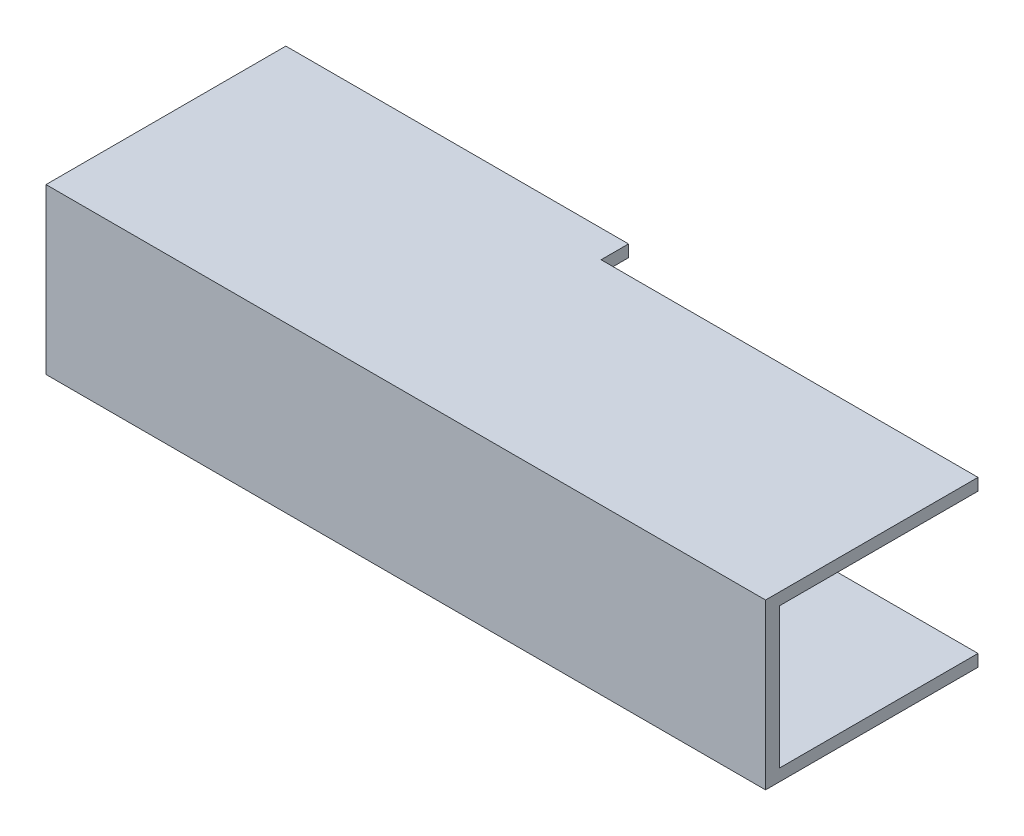
ISO-10303-21;
HEADER;
FILE_DESCRIPTION(('STEP AP214'),'2;1');
FILE_NAME('part.step','',(''),(''),'','','');
FILE_SCHEMA(('AUTOMOTIVE_DESIGN { 1 0 10303 214 1 1 1 1 }'));
ENDSEC;
DATA;
#1=APPLICATION_CONTEXT('core data for automotive mechanical design processes');
#2=APPLICATION_PROTOCOL_DEFINITION('international standard','automotive_design',2000,#1);
#3=PRODUCT_CONTEXT('',#1,'mechanical');
#4=PRODUCT('Part','Part','',(#3));
#5=PRODUCT_RELATED_PRODUCT_CATEGORY('part','',(#4));
#6=PRODUCT_DEFINITION_FORMATION('','',#4);
#7=PRODUCT_DEFINITION_CONTEXT('part definition',#1,'design');
#8=PRODUCT_DEFINITION('design','',#6,#7);
#9=PRODUCT_DEFINITION_SHAPE('','',#8);
#10=(LENGTH_UNIT() NAMED_UNIT(*) SI_UNIT(.MILLI.,.METRE.));
#11=(NAMED_UNIT(*) PLANE_ANGLE_UNIT() SI_UNIT($,.RADIAN.));
#12=(NAMED_UNIT(*) SI_UNIT($,.STERADIAN.) SOLID_ANGLE_UNIT());
#13=UNCERTAINTY_MEASURE_WITH_UNIT(LENGTH_MEASURE(1.E-05),#10,'distance_accuracy_value','');
#14=(GEOMETRIC_REPRESENTATION_CONTEXT(3) GLOBAL_UNCERTAINTY_ASSIGNED_CONTEXT((#13)) GLOBAL_UNIT_ASSIGNED_CONTEXT((#10,
#11,#12)) REPRESENTATION_CONTEXT('',''));
#15=CARTESIAN_POINT('',(0.,0.,0.));
#16=DIRECTION('',(0.,0.,1.));
#17=DIRECTION('',(1.,0.,0.));
#18=AXIS2_PLACEMENT_3D('',#15,#16,#17);
#19=CARTESIAN_POINT('',(0.,0.,0.));
#20=DIRECTION('',(0.,0.,1.));
#21=DIRECTION('',(1.,0.,0.));
#22=AXIS2_PLACEMENT_3D('',#19,#20,#21);
#23=PLANE('',#22);
#24=DIRECTION('',(0.,-1.,0.));
#25=VECTOR('',#24,1.);
#26=CARTESIAN_POINT('',(-18.5416666666666,18.0340909090909,0.));
#27=LINE('',#26,#25);
#28=CARTESIAN_POINT('',(-18.5416666666667,-4.21590909090913,0.));
#29=VERTEX_POINT('',#28);
#30=CARTESIAN_POINT('',(-18.5416666666667,-5.96590909090908,0.));
#31=VERTEX_POINT('',#30);
#32=EDGE_CURVE('E254',#29,#31,#27,.T.);
#33=ORIENTED_EDGE('',*,*,#32,.T.);
#34=DIRECTION('',(1.,0.,0.));
#35=VECTOR('',#34,1.);
#36=CARTESIAN_POINT('',(-68.5416666666667,-5.9659090909091,0.));
#37=LINE('',#36,#35);
#38=CARTESIAN_POINT('',(-68.5416666666667,-5.9659090909091,0.));
#39=VERTEX_POINT('',#38);
#40=EDGE_CURVE('E229',#39,#31,#37,.T.);
#41=ORIENTED_EDGE('',*,*,#40,.F.);
#42=DIRECTION('',(0.,-1.,0.));
#43=VECTOR('',#42,1.);
#44=CARTESIAN_POINT('',(-68.5416666666666,18.0340909090909,0.));
#45=LINE('',#44,#43);
#46=CARTESIAN_POINT('',(-68.5416666666667,-4.2159090909091,0.));
#47=VERTEX_POINT('',#46);
#48=EDGE_CURVE('E209',#47,#39,#45,.T.);
#49=ORIENTED_EDGE('',*,*,#48,.F.);
#50=DIRECTION('',(-1.,0.,0.));
#51=VECTOR('',#50,1.);
#52=CARTESIAN_POINT('',(-18.5416666666667,-4.21590909090913,0.));
#53=LINE('',#52,#51);
#54=EDGE_CURVE('E150',#29,#47,#53,.T.);
#55=ORIENTED_EDGE('',*,*,#54,.F.);
#56=EDGE_LOOP('',(#33,#41,#49,#55));
#57=FACE_BOUND('',#56,.T.);
#58=ADVANCED_FACE('F39',(#57),#23,.F.);
#59=CARTESIAN_POINT('',(-18.5416666666666,18.0340909090909,0.));
#60=VERTEX_POINT('',#59);
#61=CARTESIAN_POINT('',(-18.5416666666666,16.2840909090909,0.));
#62=VERTEX_POINT('',#61);
#63=EDGE_CURVE('E266',#60,#62,#27,.T.);
#64=ORIENTED_EDGE('',*,*,#63,.T.);
#65=DIRECTION('',(-1.,0.,0.));
#66=VECTOR('',#65,1.);
#67=CARTESIAN_POINT('',(-18.5416666666666,16.2840909090909,0.));
#68=LINE('',#67,#66);
#69=CARTESIAN_POINT('',(-68.5416666666666,16.2840909090909,0.));
#70=VERTEX_POINT('',#69);
#71=EDGE_CURVE('E205',#62,#70,#68,.T.);
#72=ORIENTED_EDGE('',*,*,#71,.T.);
#73=CARTESIAN_POINT('',(-68.5416666666666,18.0340909090909,0.));
#74=VERTEX_POINT('',#73);
#75=EDGE_CURVE('E225',#74,#70,#45,.T.);
#76=ORIENTED_EDGE('',*,*,#75,.F.);
#77=DIRECTION('',(-1.,0.,0.));
#78=VECTOR('',#77,1.);
#79=CARTESIAN_POINT('',(-68.5416666666666,18.0340909090909,0.));
#80=LINE('',#79,#78);
#81=EDGE_CURVE('E79',#60,#74,#80,.T.);
#82=ORIENTED_EDGE('',*,*,#81,.F.);
#83=EDGE_LOOP('',(#64,#72,#76,#82));
#84=FACE_BOUND('',#83,.T.);
#85=ADVANCED_FACE('F275',(#84),#23,.F.);
#86=CARTESIAN_POINT('',(-68.5416666666666,18.0340909090909,35.));
#87=DIRECTION('',(1.,0.,0.));
#88=DIRECTION('',(0.,1.,0.));
#89=AXIS2_PLACEMENT_3D('',#86,#87,#88);
#90=PLANE('',#89);
#91=ORIENTED_EDGE('',*,*,#75,.T.);
#92=DIRECTION('',(0.,0.,-1.));
#93=VECTOR('',#92,1.);
#94=CARTESIAN_POINT('',(-68.5416666666666,16.2840909090909,0.));
#95=LINE('',#94,#93);
#96=CARTESIAN_POINT('',(-68.5416666666666,16.2840909090909,33.));
#97=VERTEX_POINT('',#96);
#98=EDGE_CURVE('E194',#97,#70,#95,.T.);
#99=ORIENTED_EDGE('',*,*,#98,.F.);
#100=DIRECTION('',(0.,1.,0.));
#101=VECTOR('',#100,1.);
#102=CARTESIAN_POINT('',(-68.5416666666666,16.2840909090909,33.));
#103=LINE('',#102,#101);
#104=CARTESIAN_POINT('',(-68.5416666666667,-4.2159090909091,33.));
#105=VERTEX_POINT('',#104);
#106=EDGE_CURVE('E199',#105,#97,#103,.T.);
#107=ORIENTED_EDGE('',*,*,#106,.F.);
#108=DIRECTION('',(0.,0.,1.));
#109=VECTOR('',#108,1.);
#110=CARTESIAN_POINT('',(-68.5416666666667,-4.2159090909091,33.));
#111=LINE('',#110,#109);
#112=EDGE_CURVE('E144',#47,#105,#111,.T.);
#113=ORIENTED_EDGE('',*,*,#112,.F.);
#114=ORIENTED_EDGE('',*,*,#48,.T.);
#115=DIRECTION('',(0.,0.,-1.));
#116=VECTOR('',#115,1.);
#117=CARTESIAN_POINT('',(-68.5416666666667,-5.9659090909091,35.));
#118=LINE('',#117,#116);
#119=CARTESIAN_POINT('',(-68.5416666666667,-5.9659090909091,35.));
#120=VERTEX_POINT('',#119);
#121=EDGE_CURVE('E11',#120,#39,#118,.T.);
#122=ORIENTED_EDGE('',*,*,#121,.F.);
#123=DIRECTION('',(0.,-1.,0.));
#124=VECTOR('',#123,1.);
#125=CARTESIAN_POINT('',(-68.5416666666666,18.0340909090909,35.));
#126=LINE('',#125,#124);
#127=CARTESIAN_POINT('',(-68.5416666666666,18.0340909090909,35.));
#128=VERTEX_POINT('',#127);
#129=EDGE_CURVE('E214',#128,#120,#126,.T.);
#130=ORIENTED_EDGE('',*,*,#129,.F.);
#131=DIRECTION('',(0.,0.,-1.));
#132=VECTOR('',#131,1.);
#133=CARTESIAN_POINT('',(-68.5416666666666,18.0340909090909,35.));
#134=LINE('',#133,#132);
#135=EDGE_CURVE('E224',#128,#74,#134,.T.);
#136=ORIENTED_EDGE('',*,*,#135,.T.);
#137=EDGE_LOOP('',(#91,#99,#107,#113,#114,#122,#130,#136));
#138=FACE_BOUND('',#137,.T.);
#139=ADVANCED_FACE('F41',(#138),#90,.F.);
#140=CARTESIAN_POINT('',(-68.5416666666667,-5.9659090909091,35.));
#141=DIRECTION('',(0.,1.,0.));
#142=DIRECTION('',(0.,0.,1.));
#143=AXIS2_PLACEMENT_3D('',#140,#141,#142);
#144=PLANE('',#143);
#145=DIRECTION('',(0.,0.,1.));
#146=VECTOR('',#145,1.);
#147=CARTESIAN_POINT('',(-18.5416666666667,-5.96590909090908,0.));
#148=LINE('',#147,#146);
#149=CARTESIAN_POINT('',(-18.5416666666667,-5.9659090909091,4.));
#150=VERTEX_POINT('',#149);
#151=EDGE_CURVE('E246',#31,#150,#148,.T.);
#152=ORIENTED_EDGE('',*,*,#151,.T.);
#153=DIRECTION('',(1.,0.,0.));
#154=VECTOR('',#153,1.);
#155=CARTESIAN_POINT('',(-59.346078192873,-5.96590909090907,4.));
#156=LINE('',#155,#154);
#157=CARTESIAN_POINT('',(36.4583333333333,-5.9659090909091,4.));
#158=VERTEX_POINT('',#157);
#159=EDGE_CURVE('E183',#150,#158,#156,.T.);
#160=ORIENTED_EDGE('',*,*,#159,.T.);
#161=DIRECTION('',(0.,0.,-1.));
#162=VECTOR('',#161,1.);
#163=CARTESIAN_POINT('',(36.4583333333333,-5.9659090909091,35.));
#164=LINE('',#163,#162);
#165=CARTESIAN_POINT('',(36.4583333333333,-5.9659090909091,35.));
#166=VERTEX_POINT('',#165);
#167=EDGE_CURVE('E48',#166,#158,#164,.T.);
#168=ORIENTED_EDGE('',*,*,#167,.F.);
#169=DIRECTION('',(1.,0.,0.));
#170=VECTOR('',#169,1.);
#171=CARTESIAN_POINT('',(-68.5416666666667,-5.9659090909091,35.));
#172=LINE('',#171,#170);
#173=EDGE_CURVE('E86',#120,#166,#172,.T.);
#174=ORIENTED_EDGE('',*,*,#173,.F.);
#175=ORIENTED_EDGE('',*,*,#121,.T.);
#176=ORIENTED_EDGE('',*,*,#40,.T.);
#177=EDGE_LOOP('',(#152,#160,#168,#174,#175,#176));
#178=FACE_BOUND('',#177,.T.);
#179=ADVANCED_FACE('F244',(#178),#144,.F.);
#180=CARTESIAN_POINT('',(36.4583333333334,18.0340909090909,35.));
#181=DIRECTION('',(-1.,0.,0.));
#182=DIRECTION('',(0.,-1.,0.));
#183=AXIS2_PLACEMENT_3D('',#180,#181,#182);
#184=PLANE('',#183);
#185=DIRECTION('',(0.,0.,1.));
#186=VECTOR('',#185,1.);
#187=CARTESIAN_POINT('',(36.4583333333334,16.2840909090909,33.));
#188=LINE('',#187,#186);
#189=CARTESIAN_POINT('',(36.4583333333334,16.2840909090909,4.));
#190=VERTEX_POINT('',#189);
#191=CARTESIAN_POINT('',(36.4583333333334,16.2840909090909,33.));
#192=VERTEX_POINT('',#191);
#193=EDGE_CURVE('E173',#190,#192,#188,.T.);
#194=ORIENTED_EDGE('',*,*,#193,.F.);
#195=DIRECTION('',(0.,-1.,0.));
#196=VECTOR('',#195,1.);
#197=CARTESIAN_POINT('',(36.4583333333334,16.2840909090909,4.));
#198=LINE('',#197,#196);
#199=CARTESIAN_POINT('',(36.4583333333334,18.0340909090909,4.));
#200=VERTEX_POINT('',#199);
#201=EDGE_CURVE('E166',#200,#190,#198,.T.);
#202=ORIENTED_EDGE('',*,*,#201,.F.);
#203=DIRECTION('',(0.,0.,-1.));
#204=VECTOR('',#203,1.);
#205=CARTESIAN_POINT('',(36.4583333333334,18.0340909090909,35.));
#206=LINE('',#205,#204);
#207=CARTESIAN_POINT('',(36.4583333333334,18.0340909090909,35.));
#208=VERTEX_POINT('',#207);
#209=EDGE_CURVE('E237',#208,#200,#206,.T.);
#210=ORIENTED_EDGE('',*,*,#209,.F.);
#211=DIRECTION('',(0.,1.,0.));
#212=VECTOR('',#211,1.);
#213=CARTESIAN_POINT('',(36.4583333333334,18.0340909090909,35.));
#214=LINE('',#213,#212);
#215=EDGE_CURVE('E219',#166,#208,#214,.T.);
#216=ORIENTED_EDGE('',*,*,#215,.F.);
#217=ORIENTED_EDGE('',*,*,#167,.T.);
#218=DIRECTION('',(0.,-1.,0.));
#219=VECTOR('',#218,1.);
#220=CARTESIAN_POINT('',(36.4583333333333,-5.9659090909091,4.));
#221=LINE('',#220,#219);
#222=CARTESIAN_POINT('',(36.4583333333333,-4.2159090909091,4.));
#223=VERTEX_POINT('',#222);
#224=EDGE_CURVE('E162',#223,#158,#221,.T.);
#225=ORIENTED_EDGE('',*,*,#224,.F.);
#226=DIRECTION('',(0.,0.,-1.));
#227=VECTOR('',#226,1.);
#228=CARTESIAN_POINT('',(36.4583333333333,-4.2159090909091,4.));
#229=LINE('',#228,#227);
#230=CARTESIAN_POINT('',(36.4583333333333,-4.2159090909091,33.));
#231=VERTEX_POINT('',#230);
#232=EDGE_CURVE('E141',#231,#223,#229,.T.);
#233=ORIENTED_EDGE('',*,*,#232,.F.);
#234=DIRECTION('',(0.,-1.,0.));
#235=VECTOR('',#234,1.);
#236=CARTESIAN_POINT('',(36.4583333333333,-4.2159090909091,33.));
#237=LINE('',#236,#235);
#238=EDGE_CURVE('E153',#192,#231,#237,.T.);
#239=ORIENTED_EDGE('',*,*,#238,.F.);
#240=EDGE_LOOP('',(#194,#202,#210,#216,#217,#225,#233,#239));
#241=FACE_BOUND('',#240,.T.);
#242=ADVANCED_FACE('F160',(#241),#184,.F.);
#243=CARTESIAN_POINT('',(-68.5416666666666,18.0340909090909,35.));
#244=DIRECTION('',(0.,-1.,0.));
#245=DIRECTION('',(0.,0.,-1.));
#246=AXIS2_PLACEMENT_3D('',#243,#244,#245);
#247=PLANE('',#246);
#248=ORIENTED_EDGE('',*,*,#209,.T.);
#249=DIRECTION('',(1.,0.,0.));
#250=VECTOR('',#249,1.);
#251=CARTESIAN_POINT('',(-59.346078192873,18.0340909090909,4.));
#252=LINE('',#251,#250);
#253=CARTESIAN_POINT('',(-18.5416666666666,18.0340909090909,4.));
#254=VERTEX_POINT('',#253);
#255=EDGE_CURVE('E180',#254,#200,#252,.T.);
#256=ORIENTED_EDGE('',*,*,#255,.F.);
#257=DIRECTION('',(0.,0.,-1.));
#258=VECTOR('',#257,1.);
#259=CARTESIAN_POINT('',(-18.5416666666666,18.0340909090909,4.));
#260=LINE('',#259,#258);
#261=EDGE_CURVE('E264',#254,#60,#260,.T.);
#262=ORIENTED_EDGE('',*,*,#261,.T.);
#263=ORIENTED_EDGE('',*,*,#81,.T.);
#264=ORIENTED_EDGE('',*,*,#135,.F.);
#265=DIRECTION('',(-1.,0.,0.));
#266=VECTOR('',#265,1.);
#267=CARTESIAN_POINT('',(-68.5416666666666,18.0340909090909,35.));
#268=LINE('',#267,#266);
#269=EDGE_CURVE('E64',#208,#128,#268,.T.);
#270=ORIENTED_EDGE('',*,*,#269,.F.);
#271=EDGE_LOOP('',(#248,#256,#262,#263,#264,#270));
#272=FACE_BOUND('',#271,.T.);
#273=ADVANCED_FACE('F284',(#272),#247,.F.);
#274=CARTESIAN_POINT('',(0.,0.,35.));
#275=DIRECTION('',(0.,0.,1.));
#276=DIRECTION('',(1.,0.,0.));
#277=AXIS2_PLACEMENT_3D('',#274,#275,#276);
#278=PLANE('',#277);
#279=ORIENTED_EDGE('',*,*,#129,.T.);
#280=ORIENTED_EDGE('',*,*,#173,.T.);
#281=ORIENTED_EDGE('',*,*,#215,.T.);
#282=ORIENTED_EDGE('',*,*,#269,.T.);
#283=EDGE_LOOP('',(#279,#280,#281,#282));
#284=FACE_BOUND('',#283,.T.);
#285=ADVANCED_FACE('F306',(#284),#278,.T.);
#286=CARTESIAN_POINT('',(-18.5416666666666,16.2840909090909,0.));
#287=DIRECTION('',(0.,1.,0.));
#288=DIRECTION('',(-1.,0.,0.));
#289=AXIS2_PLACEMENT_3D('',#286,#287,#288);
#290=PLANE('',#289);
#291=ORIENTED_EDGE('',*,*,#98,.T.);
#292=ORIENTED_EDGE('',*,*,#71,.F.);
#293=DIRECTION('',(0.,0.,-1.));
#294=VECTOR('',#293,1.);
#295=CARTESIAN_POINT('',(-18.5416666666666,16.2840909090909,0.));
#296=LINE('',#295,#294);
#297=CARTESIAN_POINT('',(-18.5416666666666,16.2840909090909,4.));
#298=VERTEX_POINT('',#297);
#299=EDGE_CURVE('E193',#298,#62,#296,.T.);
#300=ORIENTED_EDGE('',*,*,#299,.F.);
#301=DIRECTION('',(1.,0.,0.));
#302=VECTOR('',#301,1.);
#303=CARTESIAN_POINT('',(-59.346078192873,16.2840909090909,4.));
#304=LINE('',#303,#302);
#305=EDGE_CURVE('E176',#298,#190,#304,.T.);
#306=ORIENTED_EDGE('',*,*,#305,.T.);
#307=ORIENTED_EDGE('',*,*,#193,.T.);
#308=DIRECTION('',(-1.,0.,0.));
#309=VECTOR('',#308,1.);
#310=CARTESIAN_POINT('',(-18.5416666666666,16.2840909090909,33.));
#311=LINE('',#310,#309);
#312=EDGE_CURVE('E149',#192,#97,#311,.T.);
#313=ORIENTED_EDGE('',*,*,#312,.T.);
#314=EDGE_LOOP('',(#291,#292,#300,#306,#307,#313));
#315=FACE_BOUND('',#314,.T.);
#316=ADVANCED_FACE('F281',(#315),#290,.F.);
#317=CARTESIAN_POINT('',(-18.5416666666666,16.2840909090909,33.));
#318=DIRECTION('',(0.,0.,1.));
#319=DIRECTION('',(1.,0.,0.));
#320=AXIS2_PLACEMENT_3D('',#317,#318,#319);
#321=PLANE('',#320);
#322=ORIENTED_EDGE('',*,*,#106,.T.);
#323=ORIENTED_EDGE('',*,*,#312,.F.);
#324=ORIENTED_EDGE('',*,*,#238,.T.);
#325=DIRECTION('',(-1.,0.,0.));
#326=VECTOR('',#325,1.);
#327=CARTESIAN_POINT('',(-18.5416666666667,-4.21590909090912,33.));
#328=LINE('',#327,#326);
#329=EDGE_CURVE('E137',#231,#105,#328,.T.);
#330=ORIENTED_EDGE('',*,*,#329,.T.);
#331=EDGE_LOOP('',(#322,#323,#324,#330));
#332=FACE_BOUND('',#331,.T.);
#333=ADVANCED_FACE('F154',(#332),#321,.F.);
#334=CARTESIAN_POINT('',(-18.5416666666667,-4.21590909090912,33.));
#335=DIRECTION('',(0.,-1.,0.));
#336=DIRECTION('',(1.,0.,0.));
#337=AXIS2_PLACEMENT_3D('',#334,#335,#336);
#338=PLANE('',#337);
#339=ORIENTED_EDGE('',*,*,#112,.T.);
#340=ORIENTED_EDGE('',*,*,#329,.F.);
#341=ORIENTED_EDGE('',*,*,#232,.T.);
#342=DIRECTION('',(1.,0.,0.));
#343=VECTOR('',#342,1.);
#344=CARTESIAN_POINT('',(-59.346078192873,-4.21590909090907,4.));
#345=LINE('',#344,#343);
#346=CARTESIAN_POINT('',(-18.5416666666667,-4.21590909090913,4.));
#347=VERTEX_POINT('',#346);
#348=EDGE_CURVE('E55',#347,#223,#345,.T.);
#349=ORIENTED_EDGE('',*,*,#348,.F.);
#350=DIRECTION('',(0.,0.,1.));
#351=VECTOR('',#350,1.);
#352=CARTESIAN_POINT('',(-18.5416666666667,-4.21590909090912,33.));
#353=LINE('',#352,#351);
#354=EDGE_CURVE('E189',#29,#347,#353,.T.);
#355=ORIENTED_EDGE('',*,*,#354,.F.);
#356=ORIENTED_EDGE('',*,*,#54,.T.);
#357=EDGE_LOOP('',(#339,#340,#341,#349,#355,#356));
#358=FACE_BOUND('',#357,.T.);
#359=ADVANCED_FACE('F139',(#358),#338,.F.);
#360=CARTESIAN_POINT('',(-18.5416666666667,0.,0.));
#361=DIRECTION('',(1.,0.,0.));
#362=DIRECTION('',(0.,1.,0.));
#363=AXIS2_PLACEMENT_3D('',#360,#361,#362);
#364=PLANE('',#363);
#365=ORIENTED_EDGE('',*,*,#299,.T.);
#366=ORIENTED_EDGE('',*,*,#63,.F.);
#367=ORIENTED_EDGE('',*,*,#261,.F.);
#368=DIRECTION('',(0.,1.,0.));
#369=VECTOR('',#368,1.);
#370=CARTESIAN_POINT('',(-18.5416666666666,16.2840909090909,4.));
#371=LINE('',#370,#369);
#372=EDGE_CURVE('E200',#298,#254,#371,.T.);
#373=ORIENTED_EDGE('',*,*,#372,.F.);
#374=EDGE_LOOP('',(#365,#366,#367,#373));
#375=FACE_BOUND('',#374,.T.);
#376=ADVANCED_FACE('F290',(#375),#364,.T.);
#377=ORIENTED_EDGE('',*,*,#354,.T.);
#378=DIRECTION('',(0.,1.,0.));
#379=VECTOR('',#378,1.);
#380=CARTESIAN_POINT('',(-18.5416666666667,-5.9659090909091,4.));
#381=LINE('',#380,#379);
#382=EDGE_CURVE('E179',#150,#347,#381,.T.);
#383=ORIENTED_EDGE('',*,*,#382,.F.);
#384=ORIENTED_EDGE('',*,*,#151,.F.);
#385=ORIENTED_EDGE('',*,*,#32,.F.);
#386=EDGE_LOOP('',(#377,#383,#384,#385));
#387=FACE_BOUND('',#386,.T.);
#388=ADVANCED_FACE('F252',(#387),#364,.T.);
#389=CARTESIAN_POINT('',(-59.346078192873,16.2840909090909,4.));
#390=DIRECTION('',(0.,0.,1.));
#391=DIRECTION('',(1.,0.,0.));
#392=AXIS2_PLACEMENT_3D('',#389,#390,#391);
#393=PLANE('',#392);
#394=ORIENTED_EDGE('',*,*,#372,.T.);
#395=ORIENTED_EDGE('',*,*,#255,.T.);
#396=ORIENTED_EDGE('',*,*,#201,.T.);
#397=ORIENTED_EDGE('',*,*,#305,.F.);
#398=EDGE_LOOP('',(#394,#395,#396,#397));
#399=FACE_BOUND('',#398,.T.);
#400=ADVANCED_FACE('F289',(#399),#393,.F.);
#401=CARTESIAN_POINT('',(-59.346078192873,-5.96590909090907,4.));
#402=DIRECTION('',(0.,0.,1.));
#403=DIRECTION('',(0.,-1.,0.));
#404=AXIS2_PLACEMENT_3D('',#401,#402,#403);
#405=PLANE('',#404);
#406=ORIENTED_EDGE('',*,*,#382,.T.);
#407=ORIENTED_EDGE('',*,*,#348,.T.);
#408=ORIENTED_EDGE('',*,*,#224,.T.);
#409=ORIENTED_EDGE('',*,*,#159,.F.);
#410=EDGE_LOOP('',(#406,#407,#408,#409));
#411=FACE_BOUND('',#410,.T.);
#412=ADVANCED_FACE('F248',(#411),#405,.F.);
#413=CLOSED_SHELL('',(#58,#85,#139,#179,#242,#273,#285,#316,#333,#359,#376,#388,#400,#412));
#414=MANIFOLD_SOLID_BREP('B2',#413);
#415=ADVANCED_BREP_SHAPE_REPRESENTATION('',(#18,#414),#14);
#416=SHAPE_DEFINITION_REPRESENTATION(#9,#415);
ENDSEC;
END-ISO-10303-21;
